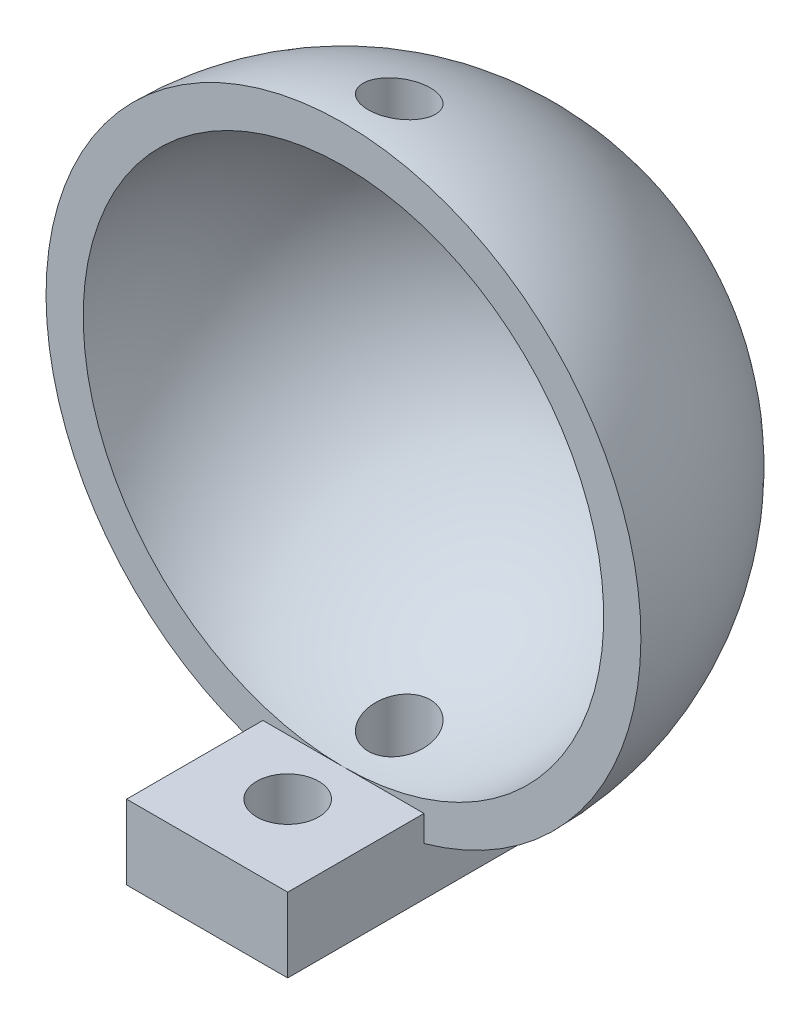
ISO-10303-21;
HEADER;
FILE_DESCRIPTION(('STEP AP214'),'2;1');
FILE_NAME('part.step','',(''),(''),'','','');
FILE_SCHEMA(('AUTOMOTIVE_DESIGN { 1 0 10303 214 1 1 1 1 }'));
ENDSEC;
DATA;
#1=APPLICATION_CONTEXT('core data for automotive mechanical design processes');
#2=APPLICATION_PROTOCOL_DEFINITION('international standard','automotive_design',2000,#1);
#3=PRODUCT_CONTEXT('',#1,'mechanical');
#4=PRODUCT('Part','Part','',(#3));
#5=PRODUCT_RELATED_PRODUCT_CATEGORY('part','',(#4));
#6=PRODUCT_DEFINITION_FORMATION('','',#4);
#7=PRODUCT_DEFINITION_CONTEXT('part definition',#1,'design');
#8=PRODUCT_DEFINITION('design','',#6,#7);
#9=PRODUCT_DEFINITION_SHAPE('','',#8);
#10=(LENGTH_UNIT() NAMED_UNIT(*) SI_UNIT(.MILLI.,.METRE.));
#11=(NAMED_UNIT(*) PLANE_ANGLE_UNIT() SI_UNIT($,.RADIAN.));
#12=(NAMED_UNIT(*) SI_UNIT($,.STERADIAN.) SOLID_ANGLE_UNIT());
#13=UNCERTAINTY_MEASURE_WITH_UNIT(LENGTH_MEASURE(1.E-05),#10,'distance_accuracy_value','');
#14=(GEOMETRIC_REPRESENTATION_CONTEXT(3) GLOBAL_UNCERTAINTY_ASSIGNED_CONTEXT((#13)) GLOBAL_UNIT_ASSIGNED_CONTEXT((#10,
#11,#12)) REPRESENTATION_CONTEXT('',''));
#15=CARTESIAN_POINT('',(0.,0.,0.));
#16=DIRECTION('',(0.,0.,1.));
#17=DIRECTION('',(1.,0.,0.));
#18=AXIS2_PLACEMENT_3D('',#15,#16,#17);
#19=CARTESIAN_POINT('',(-1.99999999999943,73.7499999999998,-7.72499999999961));
#20=DIRECTION('',(0.,0.,-1.));
#21=DIRECTION('',(0.,-1.,0.));
#22=AXIS2_PLACEMENT_3D('',#19,#20,#21);
#23=SPHERICAL_SURFACE('',#22,10.5);
#24=CARTESIAN_POINT('',(-2.83166358053873,83.7212418492871,-10.9081857740047));
#25=CARTESIAN_POINT('',(-2.88488711781957,83.7319461406064,-10.8607478732311));
#26=CARTESIAN_POINT('',(-2.93397592633407,83.7436498348414,-10.8088043231445));
#27=CARTESIAN_POINT('',(-3.02251204984405,83.7686727158865,-10.6975230307444));
#28=CARTESIAN_POINT('',(-3.06194469353387,83.7819943155215,-10.6381742411025));
#29=CARTESIAN_POINT('',(-3.13005778239995,83.8098149040178,-10.5139593463123));
#30=CARTESIAN_POINT('',(-3.1587531019362,83.8243122299998,-10.4491010275655));
#31=CARTESIAN_POINT('',(-3.20475436534988,83.8540714457462,-10.3156581095942));
#32=CARTESIAN_POINT('',(-3.22206336369659,83.8693331292827,-10.2470745150526));
#33=CARTESIAN_POINT('',(-3.24506218690222,83.9004262979057,-10.1070202418261));
#34=CARTESIAN_POINT('',(-3.25057698198638,83.9162628660222,-10.0355219083376));
#35=CARTESIAN_POINT('',(-3.24932733068091,83.9478442077759,-9.89260510232819));
#36=CARTESIAN_POINT('',(-3.24256151728803,83.9635889709982,-9.82118663958345));
#37=CARTESIAN_POINT('',(-3.216814871522,83.9946530572612,-9.67996148542844));
#38=CARTESIAN_POINT('',(-3.19775157217314,84.0099687741553,-9.61016899634204));
#39=CARTESIAN_POINT('',(-3.14779709823688,84.0396277625136,-9.4747290242553));
#40=CARTESIAN_POINT('',(-3.11690624550109,84.0539710604268,-9.40908142852065));
#41=CARTESIAN_POINT('',(-3.04440470077633,84.0811518219082,-9.28444119817581));
#42=CARTESIAN_POINT('',(-3.00288943760824,84.0940012814028,-9.22539571847276));
#43=CARTESIAN_POINT('',(-2.91011119922245,84.1179596962457,-9.1151234447898));
#44=CARTESIAN_POINT('',(-2.85884925995347,84.1290688363394,-9.0638958209126));
#45=CARTESIAN_POINT('',(-2.74911700595103,84.1490078266484,-8.97182975856954));
#46=CARTESIAN_POINT('',(-2.6908112933159,84.1578788050945,-8.93080409067252));
#47=CARTESIAN_POINT('',(-2.567850995075,84.1733562182939,-8.85915673276645));
#48=CARTESIAN_POINT('',(-2.50319724855555,84.1799629518193,-8.82853367011584));
#49=CARTESIAN_POINT('',(-2.37092779238765,84.1905860003687,-8.7792648233859));
#50=CARTESIAN_POINT('',(-2.3034100732922,84.1946567126118,-8.76036756119062));
#51=CARTESIAN_POINT('',(-2.16606783075395,84.2003116303335,-8.73410998974116));
#52=CARTESIAN_POINT('',(-2.0962435404864,84.2018960863713,-8.72674851793628));
#53=CARTESIAN_POINT('',(-1.95738171840089,84.2025250994,-8.72382646970681));
#54=CARTESIAN_POINT('',(-1.88834795201281,84.2016071229857,-8.72809181569389));
#55=CARTESIAN_POINT('',(-1.75200084421606,84.1973391317408,-8.74791323450384));
#56=CARTESIAN_POINT('',(-1.68468745310673,84.1939891872507,-8.76346898077096));
#57=CARTESIAN_POINT('',(-1.55377740740868,84.1849644987858,-8.80534134999205));
#58=CARTESIAN_POINT('',(-1.49017529464698,84.1792932724858,-8.83164169045432));
#59=CARTESIAN_POINT('',(-1.36831576411831,84.1657920208952,-8.89418265615064));
#60=CARTESIAN_POINT('',(-1.31005858956036,84.1579618974339,-8.93042373341579));
#61=CARTESIAN_POINT('',(-1.19975728036059,84.1402572853693,-9.01225169210231));
#62=CARTESIAN_POINT('',(-1.14779747764872,84.1303590544917,-9.05794704505896));
#63=CARTESIAN_POINT('',(-1.05226744412057,84.1088555547542,-9.15705044357814));
#64=CARTESIAN_POINT('',(-1.00869804062898,84.0972501177561,-9.21045924880818));
#65=CARTESIAN_POINT('',(-0.930208380205345,84.0723882794578,-9.32465726043357));
#66=CARTESIAN_POINT('',(-0.895488057878273,84.0591024272462,-9.3855774545133));
#67=CARTESIAN_POINT('',(-0.836755885555664,84.0314408904595,-9.51214764401439));
#68=CARTESIAN_POINT('',(-0.812745272540188,84.0170650802176,-9.57779818477797));
#69=CARTESIAN_POINT('',(-0.775602169028646,83.9872913079307,-9.71346505931527));
#70=CARTESIAN_POINT('',(-0.762712880178067,83.9718780754485,-9.78354467897745));
#71=CARTESIAN_POINT('',(-0.748993256865044,83.9407364083844,-9.92480753648879));
#72=CARTESIAN_POINT('',(-0.748164003016171,83.9250079456834,-9.99599087266203));
#73=CARTESIAN_POINT('',(-0.758646085007221,83.8934654919708,-10.1384132609411));
#74=CARTESIAN_POINT('',(-0.770114288993044,83.8776530180879,-10.2096411690921));
#75=CARTESIAN_POINT('',(-0.805153897871632,83.8466026590797,-10.3491901986737));
#76=CARTESIAN_POINT('',(-0.828725519963881,83.831364784271,-10.4175112679162));
#77=CARTESIAN_POINT('',(-0.88733228726909,83.8019412888905,-10.5491539059043));
#78=CARTESIAN_POINT('',(-0.922348183979915,83.7877539501954,-10.6124836492634));
#79=CARTESIAN_POINT('',(-1.0029513258798,83.7608448382027,-10.7323704206646));
#80=CARTESIAN_POINT('',(-1.04853780376156,83.7481229586292,-10.7889279398437));
#81=CARTESIAN_POINT('',(-1.14822169147355,83.7247560252094,-10.8926392960355));
#82=CARTESIAN_POINT('',(-1.20216694908967,83.7140802813731,-10.9399323770013));
#83=CARTESIAN_POINT('',(-1.3176040798767,83.6949103945736,-11.0247443201083));
#84=CARTESIAN_POINT('',(-1.37909490667833,83.6864159496266,-11.0622645352371));
#85=CARTESIAN_POINT('',(-1.50628416660842,83.6720848183762,-11.1255073830513));
#86=CARTESIAN_POINT('',(-1.57184524060044,83.6661889381181,-11.1514928813752));
#87=CARTESIAN_POINT('',(-1.7065642377407,83.6569698928142,-11.1921042275242));
#88=CARTESIAN_POINT('',(-1.77572153148062,83.6536462791784,-11.20673205607));
#89=CARTESIAN_POINT('',(-1.91414599155806,83.6497321048182,-11.2239573417593));
#90=CARTESIAN_POINT('',(-1.9833817372459,83.6490868208449,-11.226795680958));
#91=CARTESIAN_POINT('',(-2.12136453218124,83.650402008004,-11.2210089988926));
#92=CARTESIAN_POINT('',(-2.19011148117502,83.6523629990262,-11.2123816905048));
#93=CARTESIAN_POINT('',(-2.32468336629278,83.6588003008111,-11.1840414994352));
#94=CARTESIAN_POINT('',(-2.39052424519653,83.6632603612632,-11.1644002348629));
#95=CARTESIAN_POINT('',(-2.51787650103327,83.6745294436645,-11.1147215100726));
#96=CARTESIAN_POINT('',(-2.57939302044377,83.6813356167396,-11.0846966584534));
#97=CARTESIAN_POINT('',(-2.67246819089123,83.6938377821785,-11.029469227772));
#98=CARTESIAN_POINT('',(-2.70597756078148,83.6988467788786,-11.0073280685698));
#99=CARTESIAN_POINT('',(-2.77064620643718,83.7095462991305,-10.9599924934822));
#100=CARTESIAN_POINT('',(-2.8018055214252,83.7152368113037,-10.9347981285734));
#101=CARTESIAN_POINT('',(-2.83166358053873,83.7212418492871,-10.9081857740047));
#102=B_SPLINE_CURVE_WITH_KNOTS('',3,(#24,#25,#26,#27,#28,#29,#30,#31,#32,#33,#34,#35,#36,#37,
#38,#39,#40,#41,#42,#43,#44,#45,#46,#47,#48,#49,#50,#51,#52,#53,#54,#55,#56,#57,#58,#59,#60,#61,
#62,#63,#64,#65,#66,#67,#68,#69,#70,#71,#72,#73,#74,#75,#76,#77,#78,#79,#80,#81,#82,#83,#84,#85,
#86,#87,#88,#89,#90,#91,#92,#93,#94,#95,#96,#97,#98,#99,#100,#101),.UNSPECIFIED.,.T.,.F.,(4,2,2,
2,2,2,2,2,2,2,2,2,2,2,2,2,2,2,2,2,2,2,2,2,2,2,2,2,2,2,2,2,2,2,2,2,2,2,4),(0.,0.216133222611935,
0.432592822353341,0.648751441721287,0.864852051185037,1.08413802769186,1.30344841528782,
1.52424500661788,1.74503559005359,1.96390866721666,2.18275849392393,2.3972329831561,
2.61167916110925,2.82135100229832,3.03100171187734,3.23753082406047,3.44405396297581,
3.65026528827214,3.85648599208754,4.06521885618507,4.27397229159573,4.48709138299298,
4.70023508344709,4.91792956578359,5.13564355404714,5.35616813901235,5.57669668149596,
5.79685620229813,6.0169997469537,6.23352607440371,6.45002240928551,6.66129389898069,
6.87252853570388,7.07942534473849,7.28636343095573,7.49197125327293,7.69733028136104,
7.81858164116935,7.93983097683623),.UNSPECIFIED.);
#103=CARTESIAN_POINT('',(-2.83166358053873,83.7212418492871,-10.9081857740047));
#104=VERTEX_POINT('',#103);
#105=EDGE_CURVE('E181',#104,#104,#102,.T.);
#106=ORIENTED_EDGE('',*,*,#105,.T.);
#107=EDGE_LOOP('',(#106));
#108=FACE_BOUND('',#107,.T.);
#109=CARTESIAN_POINT('',(-1.99999999999943,73.7499999999998,-7.72499999999961));
#110=DIRECTION('',(0.,0.,-1.));
#111=DIRECTION('',(-1.,0.,0.));
#112=AXIS2_PLACEMENT_3D('',#109,#110,#111);
#113=CIRCLE('',#112,10.5);
#114=CARTESIAN_POINT('',(-1.99999999999943,63.2499999999999,-7.72499999999961));
#115=VERTEX_POINT('',#114);
#116=EDGE_CURVE('E127',#115,#115,#113,.T.);
#117=ORIENTED_EDGE('',*,*,#116,.F.);
#118=EDGE_LOOP('',(#117));
#119=FACE_BOUND('',#118,.T.);
#120=CARTESIAN_POINT('',(-2.90342883502389,63.7631352320851,-10.8388960238626));
#121=CARTESIAN_POINT('',(-2.85567648504222,63.7743850945592,-10.8888297206163));
#122=CARTESIAN_POINT('',(-2.80364980105643,63.7847897205987,-10.9349270562212));
#123=CARTESIAN_POINT('',(-2.69239767342072,63.803571087505,-11.0180312470282));
#124=CARTESIAN_POINT('',(-2.6331656386802,63.8119459503756,-11.0550296841252));
#125=CARTESIAN_POINT('',(-2.50910536847121,63.826383912707,-11.1187546905972));
#126=CARTESIAN_POINT('',(-2.44427453221278,63.8324459306297,-11.1454764544164));
#127=CARTESIAN_POINT('',(-2.31090070694829,63.8420384043983,-11.1877378369385));
#128=CARTESIAN_POINT('',(-2.24235865423635,63.8455694955945,-11.2032802620464));
#129=CARTESIAN_POINT('',(-2.10455657175693,63.8499441060285,-11.2225329041577));
#130=CARTESIAN_POINT('',(-2.03532105521495,63.8508255570755,-11.2264101190969));
#131=CARTESIAN_POINT('',(-1.89717731035239,63.8499774097944,-11.2226784206247));
#132=CARTESIAN_POINT('',(-1.82826907263047,63.8482478869292,-11.2150698391784));
#133=CARTESIAN_POINT('',(-1.69327921599907,63.8422621628122,-11.1887199289939));
#134=CARTESIAN_POINT('',(-1.62718008892184,63.8380252728305,-11.1700636865735));
#135=CARTESIAN_POINT('',(-1.49909034036239,63.8271855113671,-11.1222848437014));
#136=CARTESIAN_POINT('',(-1.43709981603091,63.8205825839626,-11.0931619958642));
#137=CARTESIAN_POINT('',(-1.31836627321661,63.8051600035232,-11.0250482598125));
#138=CARTESIAN_POINT('',(-1.26167474768531,63.7963211843615,-10.9859720297393));
#139=CARTESIAN_POINT('',(-1.15564659744962,63.7767397759372,-10.8992613607567));
#140=CARTESIAN_POINT('',(-1.10631066870852,63.7659970067391,-10.8516261129591));
#141=CARTESIAN_POINT('',(-1.01527674430335,63.7426913408179,-10.7480914938305));
#142=CARTESIAN_POINT('',(-0.973760693607552,63.7300949884191,-10.6920397177534));
#143=CARTESIAN_POINT('',(-0.900700666497783,63.703634423896,-10.574047471881));
#144=CARTESIAN_POINT('',(-0.869157927909263,63.6897700546685,-10.5121062723669));
#145=CARTESIAN_POINT('',(-0.816176063539613,63.6608294741588,-10.3825227003751));
#146=CARTESIAN_POINT('',(-0.79499286053787,63.6457323896572,-10.3147803006802));
#147=CARTESIAN_POINT('',(-0.764372867293994,63.6150527593953,-10.1767955017454));
#148=CARTESIAN_POINT('',(-0.754937264441364,63.5994701647252,-10.1065528505303));
#149=CARTESIAN_POINT('',(-0.747988378216534,63.5680005318644,-9.96436405895164));
#150=CARTESIAN_POINT('',(-0.750667755047884,63.5521126036082,-9.89240862218783));
#151=CARTESIAN_POINT('',(-0.76833502039046,63.5207262583783,-9.74993447192025));
#152=CARTESIAN_POINT('',(-0.783323333119339,63.5052278548482,-9.67941580801955));
#153=CARTESIAN_POINT('',(-0.825282631623443,63.4750322424091,-9.54172578362535));
#154=CARTESIAN_POINT('',(-0.852272290683814,63.4603363222757,-9.47455982155783));
#155=CARTESIAN_POINT('',(-0.917561472901292,63.4321931004364,-9.34567977992072));
#156=CARTESIAN_POINT('',(-0.955860382422385,63.4187457310365,-9.28396540478589));
#157=CARTESIAN_POINT('',(-1.0421804106812,63.3936623296673,-9.16865012554883));
#158=CARTESIAN_POINT('',(-1.09006616411096,63.3820046824318,-9.11495265999079));
#159=CARTESIAN_POINT('',(-1.19456845159636,63.3606367769423,-9.01638805393862));
#160=CARTESIAN_POINT('',(-1.25118393068859,63.350926283706,-8.97151984794202));
#161=CARTESIAN_POINT('',(-1.37021318810851,63.3339394215066,-8.89294507577359));
#162=CARTESIAN_POINT('',(-1.4324729530128,63.326614432247,-8.85901572524326));
#163=CARTESIAN_POINT('',(-1.56202689063558,63.3143367963038,-8.80210475935221));
#164=CARTESIAN_POINT('',(-1.62932041412745,63.3093838442957,-8.7791217350015));
#165=CARTESIAN_POINT('',(-1.76552574066838,63.3020816408633,-8.74522557880838));
#166=CARTESIAN_POINT('',(-1.83437491539384,63.2996804544675,-8.73407170348552));
#167=CARTESIAN_POINT('',(-1.97300892795996,63.2973743263004,-8.72335953791271));
#168=CARTESIAN_POINT('',(-2.04279369185394,63.2974691883965,-8.72380033658541));
#169=CARTESIAN_POINT('',(-2.18051863826795,63.3001372139353,-8.73619320676774));
#170=CARTESIAN_POINT('',(-2.24847061104912,63.3026835379809,-8.74802061398846));
#171=CARTESIAN_POINT('',(-2.38138814131772,63.3101387260468,-8.78262452322895));
#172=CARTESIAN_POINT('',(-2.44635371080447,63.3150475805735,-8.80540098125133));
#173=CARTESIAN_POINT('',(-2.57171191651538,63.3271034257051,-8.86128072477338));
#174=CARTESIAN_POINT('',(-2.63208868459232,63.3342577795614,-8.89441798314471));
#175=CARTESIAN_POINT('',(-2.74641065604676,63.3505932575319,-8.9699790901227));
#176=CARTESIAN_POINT('',(-2.80035542119032,63.3597745196249,-9.01240357094112));
#177=CARTESIAN_POINT('',(-2.90121816079369,63.3800682161641,-9.1060264715655));
#178=CARTESIAN_POINT('',(-2.94801112267137,63.3912089692597,-9.15735337327834));
#179=CARTESIAN_POINT('',(-3.03234343702216,63.415009744309,-9.26680396830939));
#180=CARTESIAN_POINT('',(-3.06988176331888,63.4276699345104,-9.32492841430319));
#181=CARTESIAN_POINT('',(-3.13551638337627,63.4544637587771,-9.44769258929403));
#182=CARTESIAN_POINT('',(-3.16338577084928,63.4686237646246,-9.51244788309614));
#183=CARTESIAN_POINT('',(-3.20784071938256,63.4977910895755,-9.64553890223544));
#184=CARTESIAN_POINT('',(-3.22442544413223,63.512798471389,-9.71387489253529));
#185=CARTESIAN_POINT('',(-3.24613704971315,63.5435547265015,-9.85360349753026));
#186=CARTESIAN_POINT('',(-3.25103595089734,63.5593123293648,-9.92502967343943));
#187=CARTESIAN_POINT('',(-3.24859905323076,63.5908587769866,-10.0676885487201));
#188=CARTESIAN_POINT('',(-3.24125946739927,63.6066476299048,-10.1389211813712));
#189=CARTESIAN_POINT('',(-3.2144059971735,63.6379473528763,-10.279808553077));
#190=CARTESIAN_POINT('',(-3.19478368114117,63.6534544674823,-10.3494434499547));
#191=CARTESIAN_POINT('',(-3.14376647548988,63.6835747958288,-10.4844022297034));
#192=CARTESIAN_POINT('',(-3.11238546940275,63.6981890402104,-10.5497310901809));
#193=CARTESIAN_POINT('',(-3.05136887076316,63.7212869124569,-10.6527773845062));
#194=CARTESIAN_POINT('',(-3.02483115761801,63.7301530820095,-10.6922756492746));
#195=CARTESIAN_POINT('',(-2.96735151439515,63.7471923032519,-10.7680912602322));
#196=CARTESIAN_POINT('',(-2.93640963755077,63.7553653633173,-10.8044086448603));
#197=CARTESIAN_POINT('',(-2.90342883502389,63.7631352320851,-10.8388960238626));
#198=B_SPLINE_CURVE_WITH_KNOTS('',3,(#120,#121,#122,#123,#124,#125,#126,#127,#128,#129,#130,
#131,#132,#133,#134,#135,#136,#137,#138,#139,#140,#141,#142,#143,#144,#145,#146,#147,#148,#149,
#150,#151,#152,#153,#154,#155,#156,#157,#158,#159,#160,#161,#162,#163,#164,#165,#166,#167,#168,
#169,#170,#171,#172,#173,#174,#175,#176,#177,#178,#179,#180,#181,#182,#183,#184,#185,#186,#187,
#188,#189,#190,#191,#192,#193,#194,#195,#196,#197),.UNSPECIFIED.,.T.,.F.,(4,2,2,2,2,2,2,2,2,2,2,
2,2,2,2,2,2,2,2,2,2,2,2,2,2,2,2,2,2,2,2,2,2,2,2,2,2,2,4),(0.,0.209833661225762,
0.419860731812175,0.629985895732272,0.840058292458888,1.04710865404422,1.25415303152646,
1.45962317290297,1.66509817102941,1.87239800962089,2.07971744983623,2.2913861403337,
2.50308109152921,2.7197703903888,2.93648158935679,3.15665108300814,3.37682816494387,
3.5973490328604,3.81785793758895,4.03544875136975,4.2530132904761,4.46581639078263,
4.67859209207679,4.88694908282653,5.09528970151037,5.30137497680358,5.50745942397582,
5.71422683318428,5.92100832210919,6.13106932846587,6.34115361642999,6.55587893663322,
6.77062016847817,6.98951771995995,7.20848301794071,7.42940913872255,7.6500752289117,
7.79500141975158,7.93992585901035),.UNSPECIFIED.);
#199=CARTESIAN_POINT('',(-2.90342883502389,63.7631352320851,-10.8388960238626));
#200=VERTEX_POINT('',#199);
#201=EDGE_CURVE('E174',#200,#200,#198,.T.);
#202=ORIENTED_EDGE('',*,*,#201,.T.);
#203=EDGE_LOOP('',(#202));
#204=FACE_BOUND('',#203,.T.);
#205=ADVANCED_FACE('F33',(#108,#119,#204),#23,.F.);
#206=CARTESIAN_POINT('',(-1.99999999999943,73.7499999999998,-7.72499999999961));
#207=DIRECTION('',(0.,0.,-1.));
#208=DIRECTION('',(0.,1.,0.));
#209=AXIS2_PLACEMENT_3D('',#206,#207,#208);
#210=SPHERICAL_SURFACE('',#209,12.);
#211=CARTESIAN_POINT('',(1.25000000000057,73.7499999999998,-7.72499999999961));
#212=DIRECTION('',(-1.,0.,0.));
#213=DIRECTION('',(0.,0.,1.));
#214=AXIS2_PLACEMENT_3D('',#211,#212,#213);
#215=CIRCLE('',#214,11.5515150521479);
#216=CARTESIAN_POINT('',(1.25000000000057,63.2499999999999,-12.5403400710642));
#217=VERTEX_POINT('',#216);
#218=CARTESIAN_POINT('',(1.25000000000057,62.1984849478519,-7.72499999999961));
#219=VERTEX_POINT('',#218);
#220=EDGE_CURVE('E56',#217,#219,#215,.T.);
#221=ORIENTED_EDGE('',*,*,#220,.F.);
#222=CARTESIAN_POINT('',(-1.99999999999943,63.2499999999999,-7.72499999999961));
#223=DIRECTION('',(0.,1.,0.));
#224=DIRECTION('',(0.,0.,1.));
#225=AXIS2_PLACEMENT_3D('',#222,#223,#224);
#226=CIRCLE('',#225,5.80947501931113);
#227=CARTESIAN_POINT('',(-0.129171306612446,63.2499999999999,-13.2249999999996));
#228=VERTEX_POINT('',#227);
#229=EDGE_CURVE('E11',#217,#228,#226,.T.);
#230=ORIENTED_EDGE('',*,*,#229,.T.);
#231=CARTESIAN_POINT('',(-1.99999999999943,73.7499999999998,-13.2249999999996));
#232=DIRECTION('',(0.,0.,1.));
#233=DIRECTION('',(1.,0.,0.));
#234=AXIS2_PLACEMENT_3D('',#231,#232,#233);
#235=CIRCLE('',#234,10.6653645038508);
#236=CARTESIAN_POINT('',(-3.87082869338641,63.2499999999999,-13.2249999999996));
#237=VERTEX_POINT('',#236);
#238=EDGE_CURVE('E169',#237,#228,#235,.T.);
#239=ORIENTED_EDGE('',*,*,#238,.F.);
#240=CARTESIAN_POINT('',(-5.24999999999943,63.2499999999999,-12.5403400710642));
#241=VERTEX_POINT('',#240);
#242=EDGE_CURVE('E37',#237,#241,#226,.T.);
#243=ORIENTED_EDGE('',*,*,#242,.T.);
#244=CARTESIAN_POINT('',(-5.24999999999943,73.7499999999998,-7.72499999999961));
#245=DIRECTION('',(1.,0.,0.));
#246=DIRECTION('',(0.,0.,-1.));
#247=AXIS2_PLACEMENT_3D('',#244,#245,#246);
#248=CIRCLE('',#247,11.5515150521479);
#249=CARTESIAN_POINT('',(-5.24999999999943,62.1984849478519,-7.72499999999961));
#250=VERTEX_POINT('',#249);
#251=EDGE_CURVE('E167',#250,#241,#248,.T.);
#252=ORIENTED_EDGE('',*,*,#251,.F.);
#253=CARTESIAN_POINT('',(-1.99999999999943,73.7499999999998,-7.72499999999961));
#254=DIRECTION('',(0.,0.,-1.));
#255=DIRECTION('',(-1.,0.,0.));
#256=AXIS2_PLACEMENT_3D('',#253,#254,#255);
#257=CIRCLE('',#256,12.);
#258=EDGE_CURVE('E122',#250,#219,#257,.T.);
#259=ORIENTED_EDGE('',*,*,#258,.T.);
#260=EDGE_LOOP('',(#221,#230,#239,#243,#252,#259));
#261=FACE_BOUND('',#260,.T.);
#262=CARTESIAN_POINT('',(-2.8913117340799,85.3012438651336,-10.8513922596017));
#263=CARTESIAN_POINT('',(-2.84269985299601,85.2916146154897,-10.900827723642));
#264=CARTESIAN_POINT('',(-2.78986032662796,85.2827418713112,-10.9463173654886));
#265=CARTESIAN_POINT('',(-2.67713457575346,85.2667917221215,-11.028016097365));
#266=CARTESIAN_POINT('',(-2.6172414378153,85.2597161003167,-11.0642159699274));
#267=CARTESIAN_POINT('',(-2.49206880299891,85.247594094735,-11.1261926510409));
#268=CARTESIAN_POINT('',(-2.42678813566774,85.2425481533168,-11.1519671874488));
#269=CARTESIAN_POINT('',(-2.29272764753276,85.2346580663968,-11.1922544058759));
#270=CARTESIAN_POINT('',(-2.22394869312919,85.231813378526,-11.2067698620329));
#271=CARTESIAN_POINT('',(-2.0856077034484,85.2284381568813,-11.2239911857765));
#272=CARTESIAN_POINT('',(-2.0160614866286,85.22788362473,-11.2268195220264));
#273=CARTESIAN_POINT('',(-1.87748105789807,85.2290414527075,-11.2209128115463));
#274=CARTESIAN_POINT('',(-1.80844684100482,85.2307537907472,-11.2121778774929));
#275=CARTESIAN_POINT('',(-1.67321386038352,85.2363733294126,-11.1834967722631));
#276=CARTESIAN_POINT('',(-1.60700242065695,85.2402692805227,-11.1636080626906));
#277=CARTESIAN_POINT('',(-1.47888653896444,85.2501204742882,-11.1132784850109));
#278=CARTESIAN_POINT('',(-1.41698218305943,85.2560757580774,-11.0828374061269));
#279=CARTESIAN_POINT('',(-1.29873843323902,85.2699059928854,-11.0120697498585));
#280=CARTESIAN_POINT('',(-1.24244214724532,85.2777944087873,-10.9716738222109));
#281=CARTESIAN_POINT('',(-1.13742073965868,85.2952232187471,-10.882310351811));
#282=CARTESIAN_POINT('',(-1.08869617404936,85.3047637340083,-10.8333421801684));
#283=CARTESIAN_POINT('',(-0.999358913374485,85.3253764149515,-10.727393009746));
#284=CARTESIAN_POINT('',(-0.958888652614065,85.3364706663332,-10.6702962277112));
#285=CARTESIAN_POINT('',(-0.888088055021544,85.3597437887459,-10.5503298788909));
#286=CARTESIAN_POINT('',(-0.857758686158497,85.3719227631755,-10.4874597617584));
#287=CARTESIAN_POINT('',(-0.807552294409116,85.3972421752037,-10.3565361397651));
#288=CARTESIAN_POINT('',(-0.78786962581998,85.4103958080559,-10.2884106250819));
#289=CARTESIAN_POINT('',(-0.760281275443735,85.437094597409,-10.1498884606947));
#290=CARTESIAN_POINT('',(-0.752376480779589,85.4506397833239,-10.0794916403212));
#291=CARTESIAN_POINT('',(-0.74852243735648,85.4779033705117,-9.93754899443607));
#292=CARTESIAN_POINT('',(-0.75271370896087,85.4916219494147,-9.86599934415274));
#293=CARTESIAN_POINT('',(-0.773256004082213,85.5186879670049,-9.72459261582268));
#294=CARTESIAN_POINT('',(-0.789607307967752,85.5320353971274,-9.6547355768401));
#295=CARTESIAN_POINT('',(-0.834072305550157,85.557991403138,-9.5186683746014));
#296=CARTESIAN_POINT('',(-0.862193781291048,85.5705994838937,-9.45246065699018));
#297=CARTESIAN_POINT('',(-0.929468292824089,85.5947061965653,-9.32568457164454));
#298=CARTESIAN_POINT('',(-0.968620847399917,85.6062048768481,-9.26511595806493));
#299=CARTESIAN_POINT('',(-1.05643753832039,85.6276440033503,-9.15204152413795));
#300=CARTESIAN_POINT('',(-1.10499784591018,85.6375994974793,-9.09945795845063));
#301=CARTESIAN_POINT('',(-1.2105512003619,85.6558021582321,-9.00321289255095));
#302=CARTESIAN_POINT('',(-1.26754347324999,85.6640494814833,-8.95955057432824));
#303=CARTESIAN_POINT('',(-1.38731798998172,85.6784643559219,-8.88317541693107));
#304=CARTESIAN_POINT('',(-1.4499868216034,85.6846645324718,-8.85029088181925));
#305=CARTESIAN_POINT('',(-1.5801175318261,85.6949864544307,-8.79551675749927));
#306=CARTESIAN_POINT('',(-1.64757894724897,85.6991084003789,-8.77362610743519));
#307=CARTESIAN_POINT('',(-1.78424047400162,85.7051005532267,-8.74179548171351));
#308=CARTESIAN_POINT('',(-1.85339671379229,85.7070050663858,-8.73167343563944));
#309=CARTESIAN_POINT('',(-1.9924530953841,85.7086213559289,-8.72308354638495));
#310=CARTESIAN_POINT('',(-2.06235319388371,85.7083332592594,-8.72461502849472));
#311=CARTESIAN_POINT('',(-2.20033281439007,85.7055842094914,-8.73922400471333));
#312=CARTESIAN_POINT('',(-2.26842233091067,85.7031403624488,-8.7522106015102));
#313=CARTESIAN_POINT('',(-2.40142618296415,85.6961756265215,-8.78919998381934));
#314=CARTESIAN_POINT('',(-2.46634052058945,85.6916547390056,-8.81320276207194));
#315=CARTESIAN_POINT('',(-2.59138702504096,85.6806505915716,-8.87157926048389));
#316=CARTESIAN_POINT('',(-2.65150383337097,85.674161325354,-8.90598472228659));
#317=CARTESIAN_POINT('',(-2.76510197744157,85.6594113677546,-8.98410557656997));
#318=CARTESIAN_POINT('',(-2.81858294128959,85.6511505771619,-9.02782149046359));
#319=CARTESIAN_POINT('',(-2.9181287457541,85.6329738721798,-9.12389230799207));
#320=CARTESIAN_POINT('',(-2.96409150305741,85.6230383900319,-9.1763492511301));
#321=CARTESIAN_POINT('',(-3.04658051249441,85.6018636665831,-9.28798657211823));
#322=CARTESIAN_POINT('',(-3.0831059332555,85.590624310545,-9.34716754165389));
#323=CARTESIAN_POINT('',(-3.14633914836786,85.5669463825173,-9.47164900679114));
#324=CARTESIAN_POINT('',(-3.17286917715673,85.5544906491336,-9.53703654613388));
#325=CARTESIAN_POINT('',(-3.21455677917261,85.528888577245,-9.67121059534169));
#326=CARTESIAN_POINT('',(-3.22971381506214,85.5157422061411,-9.73999726564118));
#327=CARTESIAN_POINT('',(-3.24842009159638,85.4889246436897,-9.88007343565601));
#328=CARTESIAN_POINT('',(-3.25179988104958,85.4752486312733,-9.9513846756059));
#329=CARTESIAN_POINT('',(-3.24639606065924,85.4479317095141,-10.093573404756));
#330=CARTESIAN_POINT('',(-3.23760891635439,85.4342908115254,-10.164450761906));
#331=CARTESIAN_POINT('',(-3.20800456426712,85.4073532779452,-10.3041771501485));
#332=CARTESIAN_POINT('',(-3.18711480275494,85.3940592284258,-10.3730112929508));
#333=CARTESIAN_POINT('',(-3.1337991110397,85.3683022517951,-10.5061596415503));
#334=CARTESIAN_POINT('',(-3.10138695087724,85.355838353617,-10.5704791332655));
#335=CARTESIAN_POINT('',(-3.03920795775595,85.336288150491,-10.671219214964));
#336=CARTESIAN_POINT('',(-3.01251328028077,85.3288511261531,-10.7095016922733));
#337=CARTESIAN_POINT('',(-2.95495723965763,85.3145759999457,-10.7829184039298));
#338=CARTESIAN_POINT('',(-2.92409590451594,85.3077378940512,-10.8180526594351));
#339=CARTESIAN_POINT('',(-2.8913117340799,85.3012438651336,-10.8513922596017));
#340=B_SPLINE_CURVE_WITH_KNOTS('',3,(#262,#263,#264,#265,#266,#267,#268,#269,#270,#271,#272,
#273,#274,#275,#276,#277,#278,#279,#280,#281,#282,#283,#284,#285,#286,#287,#288,#289,#290,#291,
#292,#293,#294,#295,#296,#297,#298,#299,#300,#301,#302,#303,#304,#305,#306,#307,#308,#309,#310,
#311,#312,#313,#314,#315,#316,#317,#318,#319,#320,#321,#322,#323,#324,#325,#326,#327,#328,#329,
#330,#331,#332,#333,#334,#335,#336,#337,#338,#339),.UNSPECIFIED.,.T.,.F.,(4,2,2,2,2,2,2,2,2,2,2,
2,2,2,2,2,2,2,2,2,2,2,2,2,2,2,2,2,2,2,2,2,2,2,2,2,2,2,4),(0.,0.209825203506723,
0.419857801147246,0.629936149573124,0.839962720093209,1.04778276452691,1.25560078390515,
1.46235788131429,1.66911910880401,1.87736360602261,2.08562338720153,2.29721900450333,
2.50883481328134,2.72419339225393,2.93956819146168,3.15745504138101,3.37534691517861,
3.59338307993853,3.81140973462949,4.02715469370392,4.24287986172471,4.4549793011904,
4.66705827016736,4.87581059959317,5.08455084287863,5.29164946696079,5.49874795456479,
5.706484849282,5.91423338094238,6.12460308819459,6.33499132143943,6.54896205260399,
6.76294289256355,6.97999006027935,7.19710029283962,7.41552574437071,7.63369103550412,
7.77519947572748,7.91670696484668),.UNSPECIFIED.);
#341=CARTESIAN_POINT('',(-2.8913117340799,85.3012438651336,-10.8513922596017));
#342=VERTEX_POINT('',#341);
#343=EDGE_CURVE('E195',#342,#342,#340,.T.);
#344=ORIENTED_EDGE('',*,*,#343,.T.);
#345=EDGE_LOOP('',(#344));
#346=FACE_BOUND('',#345,.T.);
#347=ADVANCED_FACE('F199',(#261,#346),#210,.T.);
#348=CARTESIAN_POINT('',(0.,63.2499999999999,0.));
#349=DIRECTION('',(0.,1.,0.));
#350=DIRECTION('',(0.,0.,1.));
#351=AXIS2_PLACEMENT_3D('',#348,#349,#350);
#352=PLANE('',#351);
#353=ORIENTED_EDGE('',*,*,#229,.F.);
#354=DIRECTION('',(0.,0.,1.));
#355=VECTOR('',#354,1.);
#356=CARTESIAN_POINT('',(1.25000000000057,63.2499999999999,0.));
#357=LINE('',#356,#355);
#358=CARTESIAN_POINT('',(1.25000000000057,63.2499999999999,-13.2249999999996));
#359=VERTEX_POINT('',#358);
#360=EDGE_CURVE('E114',#359,#217,#357,.T.);
#361=ORIENTED_EDGE('',*,*,#360,.F.);
#362=DIRECTION('',(1.,0.,0.));
#363=VECTOR('',#362,1.);
#364=CARTESIAN_POINT('',(0.,63.2499999999999,-13.2249999999996));
#365=LINE('',#364,#363);
#366=EDGE_CURVE('E158',#228,#359,#365,.T.);
#367=ORIENTED_EDGE('',*,*,#366,.F.);
#368=EDGE_LOOP('',(#353,#361,#367));
#369=FACE_BOUND('',#368,.T.);
#370=ADVANCED_FACE('F202',(#369),#352,.T.);
#371=ORIENTED_EDGE('',*,*,#242,.F.);
#372=CARTESIAN_POINT('',(-5.24999999999943,63.2499999999999,-13.2249999999996));
#373=VERTEX_POINT('',#372);
#374=EDGE_CURVE('E115',#373,#237,#365,.T.);
#375=ORIENTED_EDGE('',*,*,#374,.F.);
#376=DIRECTION('',(0.,0.,-1.));
#377=VECTOR('',#376,1.);
#378=CARTESIAN_POINT('',(-5.24999999999943,63.2499999999999,0.));
#379=LINE('',#378,#377);
#380=EDGE_CURVE('E161',#241,#373,#379,.T.);
#381=ORIENTED_EDGE('',*,*,#380,.F.);
#382=EDGE_LOOP('',(#371,#375,#381));
#383=FACE_BOUND('',#382,.T.);
#384=ADVANCED_FACE('F208',(#383),#352,.T.);
#385=CARTESIAN_POINT('',(0.,60.2499999999998,0.));
#386=DIRECTION('',(0.,1.,0.));
#387=DIRECTION('',(0.,0.,1.));
#388=AXIS2_PLACEMENT_3D('',#385,#386,#387);
#389=PLANE('',#388);
#390=DIRECTION('',(0.,0.,1.));
#391=VECTOR('',#390,1.);
#392=CARTESIAN_POINT('',(-5.24999999999943,60.2499999999998,-13.2249999999996));
#393=LINE('',#392,#391);
#394=CARTESIAN_POINT('',(-5.24999999999943,60.2499999999998,-13.2249999999996));
#395=VERTEX_POINT('',#394);
#396=CARTESIAN_POINT('',(-5.24999999999943,60.2499999999998,-2.22499999999961));
#397=VERTEX_POINT('',#396);
#398=EDGE_CURVE('E147',#395,#397,#393,.T.);
#399=ORIENTED_EDGE('',*,*,#398,.F.);
#400=DIRECTION('',(-1.,0.,0.));
#401=VECTOR('',#400,1.);
#402=CARTESIAN_POINT('',(-5.24999999999943,60.2499999999998,-13.2249999999996));
#403=LINE('',#402,#401);
#404=CARTESIAN_POINT('',(1.25000000000057,60.2499999999998,-13.2249999999996));
#405=VERTEX_POINT('',#404);
#406=EDGE_CURVE('E141',#405,#395,#403,.T.);
#407=ORIENTED_EDGE('',*,*,#406,.F.);
#408=DIRECTION('',(0.,0.,-1.));
#409=VECTOR('',#408,1.);
#410=CARTESIAN_POINT('',(1.25000000000057,60.2499999999998,-13.2249999999996));
#411=LINE('',#410,#409);
#412=CARTESIAN_POINT('',(1.25000000000057,60.2499999999998,-2.22499999999961));
#413=VERTEX_POINT('',#412);
#414=EDGE_CURVE('E143',#413,#405,#411,.T.);
#415=ORIENTED_EDGE('',*,*,#414,.F.);
#416=DIRECTION('',(1.,0.,0.));
#417=VECTOR('',#416,1.);
#418=CARTESIAN_POINT('',(-5.24999999999943,60.2499999999998,-2.22499999999961));
#419=LINE('',#418,#417);
#420=EDGE_CURVE('E145',#397,#413,#419,.T.);
#421=ORIENTED_EDGE('',*,*,#420,.F.);
#422=EDGE_LOOP('',(#399,#407,#415,#421));
#423=FACE_BOUND('',#422,.T.);
#424=CARTESIAN_POINT('',(-1.99999999999943,60.2499999999998,-5.47499999999961));
#425=DIRECTION('',(0.,1.,0.));
#426=DIRECTION('',(0.,0.,1.));
#427=AXIS2_PLACEMENT_3D('',#424,#425,#426);
#428=CIRCLE('',#427,1.25);
#429=CARTESIAN_POINT('',(-1.99999999999943,60.2499999999998,-4.22499999999961));
#430=VERTEX_POINT('',#429);
#431=EDGE_CURVE('E150',#430,#430,#428,.T.);
#432=ORIENTED_EDGE('',*,*,#431,.T.);
#433=EDGE_LOOP('',(#432));
#434=FACE_BOUND('',#433,.T.);
#435=CARTESIAN_POINT('',(-1.99999999999943,60.2499999999998,-9.97499999999961));
#436=DIRECTION('',(0.,1.,0.));
#437=DIRECTION('',(0.,0.,1.));
#438=AXIS2_PLACEMENT_3D('',#435,#436,#437);
#439=CIRCLE('',#438,1.25);
#440=CARTESIAN_POINT('',(-1.99999999999943,60.2499999999998,-8.72499999999961));
#441=VERTEX_POINT('',#440);
#442=EDGE_CURVE('E153',#441,#441,#439,.T.);
#443=ORIENTED_EDGE('',*,*,#442,.T.);
#444=EDGE_LOOP('',(#443));
#445=FACE_BOUND('',#444,.T.);
#446=ADVANCED_FACE('F223',(#423,#434,#445),#389,.F.);
#447=CARTESIAN_POINT('',(-5.24999999999943,61.7499999999998,-13.2249999999996));
#448=DIRECTION('',(1.,0.,0.));
#449=DIRECTION('',(0.,0.,-1.));
#450=AXIS2_PLACEMENT_3D('',#447,#448,#449);
#451=PLANE('',#450);
#452=DIRECTION('',(0.,-1.,0.));
#453=VECTOR('',#452,1.);
#454=CARTESIAN_POINT('',(-5.24999999999943,61.7499999999998,-7.72499999999961));
#455=LINE('',#454,#453);
#456=CARTESIAN_POINT('',(-5.24999999999943,63.2499999999999,-7.72499999999961));
#457=VERTEX_POINT('',#456);
#458=EDGE_CURVE('E48',#457,#250,#455,.T.);
#459=ORIENTED_EDGE('',*,*,#458,.T.);
#460=ORIENTED_EDGE('',*,*,#251,.T.);
#461=ORIENTED_EDGE('',*,*,#380,.T.);
#462=DIRECTION('',(0.,-1.,0.));
#463=VECTOR('',#462,1.);
#464=CARTESIAN_POINT('',(-5.24999999999943,61.7499999999998,-13.2249999999996));
#465=LINE('',#464,#463);
#466=EDGE_CURVE('E138',#373,#395,#465,.T.);
#467=ORIENTED_EDGE('',*,*,#466,.T.);
#468=ORIENTED_EDGE('',*,*,#398,.T.);
#469=DIRECTION('',(0.,-1.,0.));
#470=VECTOR('',#469,1.);
#471=CARTESIAN_POINT('',(-5.24999999999943,61.7499999999998,-2.22499999999961));
#472=LINE('',#471,#470);
#473=CARTESIAN_POINT('',(-5.24999999999943,63.2499999999999,-2.22499999999961));
#474=VERTEX_POINT('',#473);
#475=EDGE_CURVE('E129',#474,#397,#472,.T.);
#476=ORIENTED_EDGE('',*,*,#475,.F.);
#477=EDGE_CURVE('E159',#474,#457,#379,.T.);
#478=ORIENTED_EDGE('',*,*,#477,.T.);
#479=EDGE_LOOP('',(#459,#460,#461,#467,#468,#476,#478));
#480=FACE_BOUND('',#479,.T.);
#481=ADVANCED_FACE('F35',(#480),#451,.F.);
#482=CARTESIAN_POINT('',(-5.24999999999943,61.7499999999998,-2.22499999999961));
#483=DIRECTION('',(0.,0.,-1.));
#484=DIRECTION('',(-1.,0.,0.));
#485=AXIS2_PLACEMENT_3D('',#482,#483,#484);
#486=PLANE('',#485);
#487=ORIENTED_EDGE('',*,*,#420,.T.);
#488=DIRECTION('',(0.,-1.,0.));
#489=VECTOR('',#488,1.);
#490=CARTESIAN_POINT('',(1.25000000000057,61.7499999999998,-2.22499999999961));
#491=LINE('',#490,#489);
#492=CARTESIAN_POINT('',(1.25000000000057,63.2499999999999,-2.22499999999961));
#493=VERTEX_POINT('',#492);
#494=EDGE_CURVE('E131',#493,#413,#491,.T.);
#495=ORIENTED_EDGE('',*,*,#494,.F.);
#496=DIRECTION('',(-1.,0.,0.));
#497=VECTOR('',#496,1.);
#498=CARTESIAN_POINT('',(0.,63.2499999999999,-2.22499999999961));
#499=LINE('',#498,#497);
#500=EDGE_CURVE('E111',#493,#474,#499,.T.);
#501=ORIENTED_EDGE('',*,*,#500,.T.);
#502=ORIENTED_EDGE('',*,*,#475,.T.);
#503=EDGE_LOOP('',(#487,#495,#501,#502));
#504=FACE_BOUND('',#503,.T.);
#505=ADVANCED_FACE('F218',(#504),#486,.F.);
#506=CARTESIAN_POINT('',(1.25000000000057,61.7499999999998,-13.2249999999996));
#507=DIRECTION('',(-1.,0.,0.));
#508=DIRECTION('',(0.,0.,1.));
#509=AXIS2_PLACEMENT_3D('',#506,#507,#508);
#510=PLANE('',#509);
#511=ORIENTED_EDGE('',*,*,#360,.T.);
#512=ORIENTED_EDGE('',*,*,#220,.T.);
#513=DIRECTION('',(0.,1.,0.));
#514=VECTOR('',#513,1.);
#515=CARTESIAN_POINT('',(1.25000000000057,61.7499999999998,-7.72499999999961));
#516=LINE('',#515,#514);
#517=CARTESIAN_POINT('',(1.25000000000057,63.2499999999999,-7.72499999999961));
#518=VERTEX_POINT('',#517);
#519=EDGE_CURVE('E117',#219,#518,#516,.T.);
#520=ORIENTED_EDGE('',*,*,#519,.T.);
#521=EDGE_CURVE('E103',#518,#493,#357,.T.);
#522=ORIENTED_EDGE('',*,*,#521,.T.);
#523=ORIENTED_EDGE('',*,*,#494,.T.);
#524=ORIENTED_EDGE('',*,*,#414,.T.);
#525=DIRECTION('',(0.,-1.,0.));
#526=VECTOR('',#525,1.);
#527=CARTESIAN_POINT('',(1.25000000000057,61.7499999999998,-13.2249999999996));
#528=LINE('',#527,#526);
#529=EDGE_CURVE('E135',#359,#405,#528,.T.);
#530=ORIENTED_EDGE('',*,*,#529,.F.);
#531=EDGE_LOOP('',(#511,#512,#520,#522,#523,#524,#530));
#532=FACE_BOUND('',#531,.T.);
#533=ADVANCED_FACE('F118',(#532),#510,.F.);
#534=CARTESIAN_POINT('',(-5.24999999999943,61.7499999999998,-13.2249999999996));
#535=DIRECTION('',(0.,0.,1.));
#536=DIRECTION('',(1.,0.,0.));
#537=AXIS2_PLACEMENT_3D('',#534,#535,#536);
#538=PLANE('',#537);
#539=ORIENTED_EDGE('',*,*,#374,.T.);
#540=ORIENTED_EDGE('',*,*,#238,.T.);
#541=ORIENTED_EDGE('',*,*,#366,.T.);
#542=ORIENTED_EDGE('',*,*,#529,.T.);
#543=ORIENTED_EDGE('',*,*,#406,.T.);
#544=ORIENTED_EDGE('',*,*,#466,.F.);
#545=EDGE_LOOP('',(#539,#540,#541,#542,#543,#544));
#546=FACE_BOUND('',#545,.T.);
#547=ADVANCED_FACE('F227',(#546),#538,.F.);
#548=CARTESIAN_POINT('',(-1.99999999999943,61.7499999999998,-5.47499999999961));
#549=DIRECTION('',(0.,-1.,0.));
#550=DIRECTION('',(0.,0.,-1.));
#551=AXIS2_PLACEMENT_3D('',#548,#549,#550);
#552=CYLINDRICAL_SURFACE('',#551,1.25);
#553=ORIENTED_EDGE('',*,*,#431,.F.);
#554=EDGE_LOOP('',(#553));
#555=FACE_BOUND('',#554,.T.);
#556=CARTESIAN_POINT('',(-1.99999999999943,63.2499999999999,-5.47499999999961));
#557=DIRECTION('',(0.,1.,0.));
#558=DIRECTION('',(0.,0.,1.));
#559=AXIS2_PLACEMENT_3D('',#556,#557,#558);
#560=CIRCLE('',#559,1.25);
#561=CARTESIAN_POINT('',(-1.99999999999943,63.2499999999999,-4.22499999999961));
#562=VERTEX_POINT('',#561);
#563=EDGE_CURVE('E163',#562,#562,#560,.T.);
#564=ORIENTED_EDGE('',*,*,#563,.T.);
#565=EDGE_LOOP('',(#564));
#566=FACE_BOUND('',#565,.T.);
#567=ADVANCED_FACE('F245',(#555,#566),#552,.F.);
#568=CARTESIAN_POINT('',(-1.99999999999943,61.7499999999998,-9.97499999999961));
#569=DIRECTION('',(0.,-1.,0.));
#570=DIRECTION('',(0.,0.,-1.));
#571=AXIS2_PLACEMENT_3D('',#568,#569,#570);
#572=CYLINDRICAL_SURFACE('',#571,1.25);
#573=ORIENTED_EDGE('',*,*,#442,.F.);
#574=EDGE_LOOP('',(#573));
#575=FACE_BOUND('',#574,.T.);
#576=ORIENTED_EDGE('',*,*,#201,.F.);
#577=EDGE_LOOP('',(#576));
#578=FACE_BOUND('',#577,.T.);
#579=ADVANCED_FACE('F240',(#575,#578),#572,.F.);
#580=DIRECTION('',(1.,0.,0.));
#581=VECTOR('',#580,1.);
#582=CARTESIAN_POINT('',(0.,63.2499999999999,-7.72499999999961));
#583=LINE('',#582,#581);
#584=EDGE_CURVE('E128',#457,#115,#583,.T.);
#585=ORIENTED_EDGE('',*,*,#584,.F.);
#586=ORIENTED_EDGE('',*,*,#477,.F.);
#587=ORIENTED_EDGE('',*,*,#500,.F.);
#588=ORIENTED_EDGE('',*,*,#521,.F.);
#589=EDGE_CURVE('E107',#115,#518,#583,.T.);
#590=ORIENTED_EDGE('',*,*,#589,.F.);
#591=EDGE_LOOP('',(#585,#586,#587,#588,#590));
#592=FACE_BOUND('',#591,.T.);
#593=ORIENTED_EDGE('',*,*,#563,.F.);
#594=EDGE_LOOP('',(#593));
#595=FACE_BOUND('',#594,.T.);
#596=ADVANCED_FACE('F104',(#592,#595),#352,.T.);
#597=CARTESIAN_POINT('',(-1.99999999999943,61.7499999999998,-7.72499999999961));
#598=DIRECTION('',(0.,0.,1.));
#599=DIRECTION('',(1.,0.,0.));
#600=AXIS2_PLACEMENT_3D('',#597,#598,#599);
#601=PLANE('',#600);
#602=ORIENTED_EDGE('',*,*,#458,.F.);
#603=ORIENTED_EDGE('',*,*,#584,.T.);
#604=ORIENTED_EDGE('',*,*,#116,.T.);
#605=ORIENTED_EDGE('',*,*,#589,.T.);
#606=ORIENTED_EDGE('',*,*,#519,.F.);
#607=ORIENTED_EDGE('',*,*,#258,.F.);
#608=EDGE_LOOP('',(#602,#603,#604,#605,#606,#607));
#609=FACE_BOUND('',#608,.T.);
#610=ADVANCED_FACE('F125',(#609),#601,.T.);
#611=CARTESIAN_POINT('',(-1.99999999999943,85.7499999999998,-9.97499999999959));
#612=DIRECTION('',(0.,-1.,0.));
#613=DIRECTION('',(0.,0.,-1.));
#614=AXIS2_PLACEMENT_3D('',#611,#612,#613);
#615=CYLINDRICAL_SURFACE('',#614,1.25);
#616=ORIENTED_EDGE('',*,*,#105,.F.);
#617=EDGE_LOOP('',(#616));
#618=FACE_BOUND('',#617,.T.);
#619=ORIENTED_EDGE('',*,*,#343,.F.);
#620=EDGE_LOOP('',(#619));
#621=FACE_BOUND('',#620,.T.);
#622=ADVANCED_FACE('F188',(#618,#621),#615,.F.);
#623=CLOSED_SHELL('',(#205,#347,#370,#384,#446,#481,#505,#533,#547,#567,#579,#596,#610,#622));
#624=MANIFOLD_SOLID_BREP('B2',#623);
#625=ADVANCED_BREP_SHAPE_REPRESENTATION('',(#18,#624),#14);
#626=SHAPE_DEFINITION_REPRESENTATION(#9,#625);
ENDSEC;
END-ISO-10303-21;
